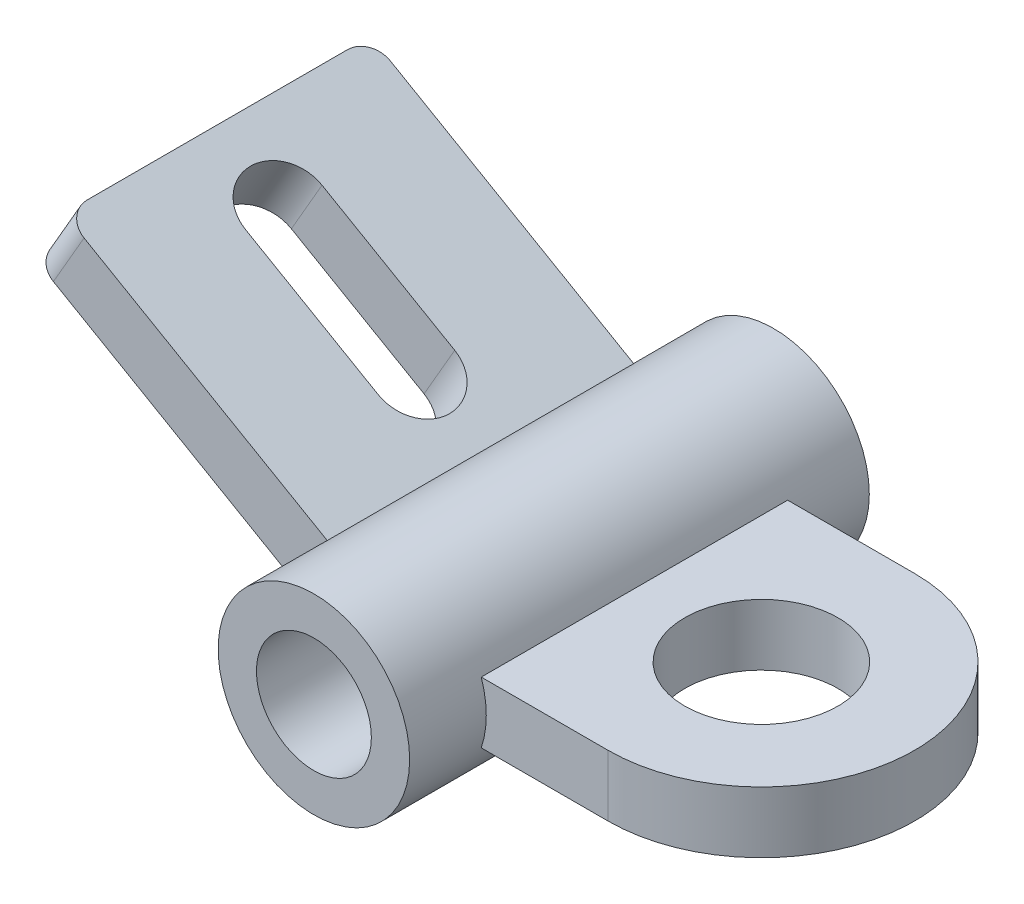
ISO-10303-21;
HEADER;
FILE_DESCRIPTION(('STEP AP214'),'2;1');
FILE_NAME('part.step','',(''),(''),'','','');
FILE_SCHEMA(('AUTOMOTIVE_DESIGN { 1 0 10303 214 1 1 1 1 }'));
ENDSEC;
DATA;
#1=APPLICATION_CONTEXT('core data for automotive mechanical design processes');
#2=APPLICATION_PROTOCOL_DEFINITION('international standard','automotive_design',2000,#1);
#3=PRODUCT_CONTEXT('',#1,'mechanical');
#4=PRODUCT('Part','Part','',(#3));
#5=PRODUCT_RELATED_PRODUCT_CATEGORY('part','',(#4));
#6=PRODUCT_DEFINITION_FORMATION('','',#4);
#7=PRODUCT_DEFINITION_CONTEXT('part definition',#1,'design');
#8=PRODUCT_DEFINITION('design','',#6,#7);
#9=PRODUCT_DEFINITION_SHAPE('','',#8);
#10=(LENGTH_UNIT() NAMED_UNIT(*) SI_UNIT(.MILLI.,.METRE.));
#11=(NAMED_UNIT(*) PLANE_ANGLE_UNIT() SI_UNIT($,.RADIAN.));
#12=(NAMED_UNIT(*) SI_UNIT($,.STERADIAN.) SOLID_ANGLE_UNIT());
#13=UNCERTAINTY_MEASURE_WITH_UNIT(LENGTH_MEASURE(1.E-05),#10,'distance_accuracy_value','');
#14=(GEOMETRIC_REPRESENTATION_CONTEXT(3) GLOBAL_UNCERTAINTY_ASSIGNED_CONTEXT((#13)) GLOBAL_UNIT_ASSIGNED_CONTEXT((#10,
#11,#12)) REPRESENTATION_CONTEXT('',''));
#15=CARTESIAN_POINT('',(0.,0.,0.));
#16=DIRECTION('',(0.,0.,1.));
#17=DIRECTION('',(1.,0.,0.));
#18=AXIS2_PLACEMENT_3D('',#15,#16,#17);
#19=CARTESIAN_POINT('',(0.,-8.,12.1976987447699));
#20=DIRECTION('',(0.,0.,1.));
#21=DIRECTION('',(1.,0.,0.));
#22=AXIS2_PLACEMENT_3D('',#19,#20,#21);
#23=PLANE('',#22);
#24=DIRECTION('',(1.,0.,0.));
#25=VECTOR('',#24,1.);
#26=CARTESIAN_POINT('',(0.,0.,12.1976987447699));
#27=LINE('',#26,#25);
#28=CARTESIAN_POINT('',(2.93186416832076,0.,12.1976987447699));
#29=VERTEX_POINT('',#28);
#30=CARTESIAN_POINT('',(19.5,0.,12.1976987447699));
#31=VERTEX_POINT('',#30);
#32=EDGE_CURVE('E235',#29,#31,#27,.T.);
#33=ORIENTED_EDGE('',*,*,#32,.F.);
#34=CARTESIAN_POINT('',(-8.91085511400625,-4.,12.1976987447699));
#35=DIRECTION('',(0.,0.,1.));
#36=DIRECTION('',(1.,0.,0.));
#37=AXIS2_PLACEMENT_3D('',#34,#35,#36);
#38=CIRCLE('',#37,12.5);
#39=CARTESIAN_POINT('',(2.93186416832076,-8.,12.1976987447699));
#40=VERTEX_POINT('',#39);
#41=EDGE_CURVE('E199',#40,#29,#38,.T.);
#42=ORIENTED_EDGE('',*,*,#41,.F.);
#43=DIRECTION('',(1.,0.,0.));
#44=VECTOR('',#43,1.);
#45=CARTESIAN_POINT('',(0.,-8.,12.1976987447699));
#46=LINE('',#45,#44);
#47=CARTESIAN_POINT('',(19.5,-8.,12.1976987447699));
#48=VERTEX_POINT('',#47);
#49=EDGE_CURVE('E226',#40,#48,#46,.T.);
#50=ORIENTED_EDGE('',*,*,#49,.T.);
#51=DIRECTION('',(0.,1.,0.));
#52=VECTOR('',#51,1.);
#53=CARTESIAN_POINT('',(19.5,-8.,12.1976987447699));
#54=LINE('',#53,#52);
#55=EDGE_CURVE('E232',#48,#31,#54,.T.);
#56=ORIENTED_EDGE('',*,*,#55,.T.);
#57=EDGE_LOOP('',(#33,#42,#50,#56));
#58=FACE_BOUND('',#57,.T.);
#59=ADVANCED_FACE('F37',(#58),#23,.T.);
#60=CARTESIAN_POINT('',(0.,-8.,-27.8023012552301));
#61=DIRECTION('',(0.,0.,-1.));
#62=DIRECTION('',(-1.,0.,0.));
#63=AXIS2_PLACEMENT_3D('',#60,#61,#62);
#64=PLANE('',#63);
#65=CARTESIAN_POINT('',(-8.91085511400625,-4.,-27.8023012552301));
#66=DIRECTION('',(0.,0.,-1.));
#67=DIRECTION('',(-1.,0.,0.));
#68=AXIS2_PLACEMENT_3D('',#65,#66,#67);
#69=CIRCLE('',#68,12.5);
#70=CARTESIAN_POINT('',(2.93186416832076,0.,-27.8023012552301));
#71=VERTEX_POINT('',#70);
#72=CARTESIAN_POINT('',(2.93186416832076,-8.,-27.8023012552301));
#73=VERTEX_POINT('',#72);
#74=EDGE_CURVE('E211',#71,#73,#69,.T.);
#75=ORIENTED_EDGE('',*,*,#74,.F.);
#76=DIRECTION('',(-1.,0.,0.));
#77=VECTOR('',#76,1.);
#78=CARTESIAN_POINT('',(0.,0.,-27.8023012552301));
#79=LINE('',#78,#77);
#80=CARTESIAN_POINT('',(19.5,0.,-27.8023012552301));
#81=VERTEX_POINT('',#80);
#82=EDGE_CURVE('E220',#81,#71,#79,.T.);
#83=ORIENTED_EDGE('',*,*,#82,.F.);
#84=DIRECTION('',(0.,1.,0.));
#85=VECTOR('',#84,1.);
#86=CARTESIAN_POINT('',(19.5,-8.,-27.8023012552301));
#87=LINE('',#86,#85);
#88=CARTESIAN_POINT('',(19.5,-8.,-27.8023012552301));
#89=VERTEX_POINT('',#88);
#90=EDGE_CURVE('E239',#89,#81,#87,.T.);
#91=ORIENTED_EDGE('',*,*,#90,.F.);
#92=DIRECTION('',(-1.,0.,0.));
#93=VECTOR('',#92,1.);
#94=CARTESIAN_POINT('',(0.,-8.,-27.8023012552301));
#95=LINE('',#94,#93);
#96=EDGE_CURVE('E223',#89,#73,#95,.T.);
#97=ORIENTED_EDGE('',*,*,#96,.T.);
#98=EDGE_LOOP('',(#75,#83,#91,#97));
#99=FACE_BOUND('',#98,.T.);
#100=ADVANCED_FACE('F295',(#99),#64,.T.);
#101=CARTESIAN_POINT('',(19.5,-8.,-7.80230125523011));
#102=DIRECTION('',(0.,1.,0.));
#103=DIRECTION('',(0.,0.,1.));
#104=AXIS2_PLACEMENT_3D('',#101,#102,#103);
#105=CYLINDRICAL_SURFACE('',#104,20.);
#106=CARTESIAN_POINT('',(19.5,0.,-7.80230125523011));
#107=DIRECTION('',(0.,1.,0.));
#108=DIRECTION('',(0.,0.,-1.));
#109=AXIS2_PLACEMENT_3D('',#106,#107,#108);
#110=CIRCLE('',#109,20.);
#111=EDGE_CURVE('E227',#31,#81,#110,.T.);
#112=ORIENTED_EDGE('',*,*,#111,.F.);
#113=ORIENTED_EDGE('',*,*,#55,.F.);
#114=CARTESIAN_POINT('',(19.5,-8.,-7.80230125523011));
#115=DIRECTION('',(0.,1.,0.));
#116=DIRECTION('',(0.,0.,-1.));
#117=AXIS2_PLACEMENT_3D('',#114,#115,#116);
#118=CIRCLE('',#117,20.);
#119=EDGE_CURVE('E229',#48,#89,#118,.T.);
#120=ORIENTED_EDGE('',*,*,#119,.T.);
#121=ORIENTED_EDGE('',*,*,#90,.T.);
#122=EDGE_LOOP('',(#112,#113,#120,#121));
#123=FACE_BOUND('',#122,.T.);
#124=ADVANCED_FACE('F301',(#123),#105,.T.);
#125=CARTESIAN_POINT('',(19.5,-8.,-7.80230125523011));
#126=DIRECTION('',(0.,-1.,0.));
#127=DIRECTION('',(0.,0.,-1.));
#128=AXIS2_PLACEMENT_3D('',#125,#126,#127);
#129=PLANE('',#128);
#130=DIRECTION('',(0.,0.,1.));
#131=VECTOR('',#130,1.);
#132=CARTESIAN_POINT('',(2.93186416832076,-8.,-37.8023012552301));
#133=LINE('',#132,#131);
#134=EDGE_CURVE('E214',#73,#40,#133,.T.);
#135=ORIENTED_EDGE('',*,*,#134,.F.);
#136=ORIENTED_EDGE('',*,*,#96,.F.);
#137=ORIENTED_EDGE('',*,*,#119,.F.);
#138=ORIENTED_EDGE('',*,*,#49,.F.);
#139=EDGE_LOOP('',(#135,#136,#137,#138));
#140=FACE_BOUND('',#139,.T.);
#141=CARTESIAN_POINT('',(19.5,-8.,-7.80230125523011));
#142=DIRECTION('',(0.,1.,0.));
#143=DIRECTION('',(0.,0.,1.));
#144=AXIS2_PLACEMENT_3D('',#141,#142,#143);
#145=CIRCLE('',#144,10.);
#146=CARTESIAN_POINT('',(19.5,-8.,2.19769874476989));
#147=VERTEX_POINT('',#146);
#148=EDGE_CURVE('E217',#147,#147,#145,.T.);
#149=ORIENTED_EDGE('',*,*,#148,.T.);
#150=EDGE_LOOP('',(#149));
#151=FACE_BOUND('',#150,.T.);
#152=ADVANCED_FACE('F307',(#140,#151),#129,.T.);
#153=CARTESIAN_POINT('',(19.5,0.,-7.80230125523011));
#154=DIRECTION('',(0.,-1.,0.));
#155=DIRECTION('',(0.,0.,-1.));
#156=AXIS2_PLACEMENT_3D('',#153,#154,#155);
#157=PLANE('',#156);
#158=CARTESIAN_POINT('',(19.5,0.,-7.80230125523011));
#159=DIRECTION('',(0.,1.,0.));
#160=DIRECTION('',(0.,0.,1.));
#161=AXIS2_PLACEMENT_3D('',#158,#159,#160);
#162=CIRCLE('',#161,10.);
#163=CARTESIAN_POINT('',(19.5,0.,2.19769874476989));
#164=VERTEX_POINT('',#163);
#165=EDGE_CURVE('E216',#164,#164,#162,.T.);
#166=ORIENTED_EDGE('',*,*,#165,.F.);
#167=EDGE_LOOP('',(#166));
#168=FACE_BOUND('',#167,.T.);
#169=ORIENTED_EDGE('',*,*,#82,.T.);
#170=DIRECTION('',(0.,0.,1.));
#171=VECTOR('',#170,1.);
#172=CARTESIAN_POINT('',(2.93186416832076,0.,-37.8023012552301));
#173=LINE('',#172,#171);
#174=EDGE_CURVE('E241',#71,#29,#173,.T.);
#175=ORIENTED_EDGE('',*,*,#174,.T.);
#176=ORIENTED_EDGE('',*,*,#32,.T.);
#177=ORIENTED_EDGE('',*,*,#111,.T.);
#178=EDGE_LOOP('',(#169,#175,#176,#177));
#179=FACE_BOUND('',#178,.T.);
#180=ADVANCED_FACE('F309',(#168,#179),#157,.F.);
#181=CARTESIAN_POINT('',(19.5,-8.,-7.80230125523011));
#182=DIRECTION('',(0.,1.,0.));
#183=DIRECTION('',(0.,0.,1.));
#184=AXIS2_PLACEMENT_3D('',#181,#182,#183);
#185=CYLINDRICAL_SURFACE('',#184,10.);
#186=ORIENTED_EDGE('',*,*,#148,.F.);
#187=EDGE_LOOP('',(#186));
#188=FACE_BOUND('',#187,.T.);
#189=ORIENTED_EDGE('',*,*,#165,.T.);
#190=EDGE_LOOP('',(#189));
#191=FACE_BOUND('',#190,.T.);
#192=ADVANCED_FACE('F312',(#188,#191),#185,.F.);
#193=CARTESIAN_POINT('',(-8.91085511400625,-4.,-37.8023012552301));
#194=DIRECTION('',(0.,0.,1.));
#195=DIRECTION('',(1.,0.,0.));
#196=AXIS2_PLACEMENT_3D('',#193,#194,#195);
#197=CYLINDRICAL_SURFACE('',#196,12.5);
#198=CARTESIAN_POINT('',(-8.91085511400625,-4.,-27.8023012552301));
#199=DIRECTION('',(0.,0.,-1.));
#200=DIRECTION('',(-1.,0.,0.));
#201=AXIS2_PLACEMENT_3D('',#198,#199,#200);
#202=CIRCLE('',#201,12.5);
#203=CARTESIAN_POINT('',(-17.1669508623892,5.38546125630127,-27.8023012552301));
#204=VERTEX_POINT('',#203);
#205=CARTESIAN_POINT('',(-21.1669508623893,-1.54274197397423,-27.8023012552301));
#206=VERTEX_POINT('',#205);
#207=EDGE_CURVE('E254',#204,#206,#202,.F.);
#208=ORIENTED_EDGE('',*,*,#207,.F.);
#209=DIRECTION('',(0.,0.,1.));
#210=VECTOR('',#209,1.);
#211=CARTESIAN_POINT('',(-17.1669508623892,5.38546125630127,-37.8023012552301));
#212=LINE('',#211,#210);
#213=CARTESIAN_POINT('',(-17.1669508623892,5.38546125630127,12.1976987447699));
#214=VERTEX_POINT('',#213);
#215=EDGE_CURVE('E249',#214,#204,#212,.F.);
#216=ORIENTED_EDGE('',*,*,#215,.F.);
#217=CARTESIAN_POINT('',(-8.91085511400625,-4.,12.1976987447699));
#218=DIRECTION('',(0.,0.,-1.));
#219=DIRECTION('',(-1.,0.,0.));
#220=AXIS2_PLACEMENT_3D('',#217,#218,#219);
#221=CIRCLE('',#220,12.5);
#222=CARTESIAN_POINT('',(-21.1669508623893,-1.54274197397423,12.1976987447699));
#223=VERTEX_POINT('',#222);
#224=EDGE_CURVE('E246',#214,#223,#221,.F.);
#225=ORIENTED_EDGE('',*,*,#224,.T.);
#226=DIRECTION('',(0.,0.,1.));
#227=VECTOR('',#226,1.);
#228=CARTESIAN_POINT('',(-21.1669508623893,-1.54274197397423,-37.8023012552301));
#229=LINE('',#228,#227);
#230=EDGE_CURVE('E251',#206,#223,#229,.T.);
#231=ORIENTED_EDGE('',*,*,#230,.F.);
#232=EDGE_LOOP('',(#208,#216,#225,#231));
#233=FACE_BOUND('',#232,.T.);
#234=CARTESIAN_POINT('',(-8.91085511400625,-4.,-37.8023012552301));
#235=DIRECTION('',(0.,0.,1.));
#236=DIRECTION('',(1.,0.,0.));
#237=AXIS2_PLACEMENT_3D('',#234,#235,#236);
#238=CIRCLE('',#237,12.5);
#239=CARTESIAN_POINT('',(3.58914488599375,-4.,-37.8023012552301));
#240=VERTEX_POINT('',#239);
#241=EDGE_CURVE('E208',#240,#240,#238,.T.);
#242=ORIENTED_EDGE('',*,*,#241,.T.);
#243=EDGE_LOOP('',(#242));
#244=FACE_BOUND('',#243,.T.);
#245=ORIENTED_EDGE('',*,*,#74,.T.);
#246=ORIENTED_EDGE('',*,*,#134,.T.);
#247=ORIENTED_EDGE('',*,*,#41,.T.);
#248=ORIENTED_EDGE('',*,*,#174,.F.);
#249=EDGE_LOOP('',(#245,#246,#247,#248));
#250=FACE_BOUND('',#249,.T.);
#251=CARTESIAN_POINT('',(-8.91085511400625,-4.,22.1976987447699));
#252=DIRECTION('',(0.,0.,1.));
#253=DIRECTION('',(1.,0.,0.));
#254=AXIS2_PLACEMENT_3D('',#251,#252,#253);
#255=CIRCLE('',#254,12.5);
#256=CARTESIAN_POINT('',(3.58914488599375,-4.,22.1976987447699));
#257=VERTEX_POINT('',#256);
#258=EDGE_CURVE('E200',#257,#257,#255,.T.);
#259=ORIENTED_EDGE('',*,*,#258,.F.);
#260=EDGE_LOOP('',(#259));
#261=FACE_BOUND('',#260,.T.);
#262=ADVANCED_FACE('F283',(#233,#244,#250,#261),#197,.T.);
#263=CARTESIAN_POINT('',(-8.91085511400625,-4.,-37.8023012552301));
#264=DIRECTION('',(0.,0.,1.));
#265=DIRECTION('',(1.,0.,0.));
#266=AXIS2_PLACEMENT_3D('',#263,#264,#265);
#267=PLANE('',#266);
#268=CARTESIAN_POINT('',(-8.91085511400625,-4.,-37.8023012552301));
#269=DIRECTION('',(0.,0.,1.));
#270=DIRECTION('',(1.,0.,0.));
#271=AXIS2_PLACEMENT_3D('',#268,#269,#270);
#272=CIRCLE('',#271,7.5);
#273=CARTESIAN_POINT('',(-1.41085511400625,-4.,-37.8023012552301));
#274=VERTEX_POINT('',#273);
#275=EDGE_CURVE('E203',#274,#274,#272,.T.);
#276=ORIENTED_EDGE('',*,*,#275,.T.);
#277=EDGE_LOOP('',(#276));
#278=FACE_BOUND('',#277,.T.);
#279=ORIENTED_EDGE('',*,*,#241,.F.);
#280=EDGE_LOOP('',(#279));
#281=FACE_BOUND('',#280,.T.);
#282=ADVANCED_FACE('F322',(#278,#281),#267,.F.);
#283=CARTESIAN_POINT('',(-8.91085511400625,-4.,-37.8023012552301));
#284=DIRECTION('',(0.,0.,1.));
#285=DIRECTION('',(1.,0.,0.));
#286=AXIS2_PLACEMENT_3D('',#283,#284,#285);
#287=CYLINDRICAL_SURFACE('',#286,7.5);
#288=ORIENTED_EDGE('',*,*,#275,.F.);
#289=EDGE_LOOP('',(#288));
#290=FACE_BOUND('',#289,.T.);
#291=CARTESIAN_POINT('',(-8.91085511400625,-4.,22.1976987447699));
#292=DIRECTION('',(0.,0.,1.));
#293=DIRECTION('',(1.,0.,0.));
#294=AXIS2_PLACEMENT_3D('',#291,#292,#293);
#295=CIRCLE('',#294,7.5);
#296=CARTESIAN_POINT('',(-1.41085511400625,-4.,22.1976987447699));
#297=VERTEX_POINT('',#296);
#298=EDGE_CURVE('E195',#297,#297,#295,.T.);
#299=ORIENTED_EDGE('',*,*,#298,.T.);
#300=EDGE_LOOP('',(#299));
#301=FACE_BOUND('',#300,.T.);
#302=ADVANCED_FACE('F325',(#290,#301),#287,.F.);
#303=CARTESIAN_POINT('',(-8.91085511400625,-4.,22.1976987447699));
#304=DIRECTION('',(0.,0.,1.));
#305=DIRECTION('',(1.,0.,0.));
#306=AXIS2_PLACEMENT_3D('',#303,#304,#305);
#307=PLANE('',#306);
#308=ORIENTED_EDGE('',*,*,#258,.T.);
#309=EDGE_LOOP('',(#308));
#310=FACE_BOUND('',#309,.T.);
#311=ORIENTED_EDGE('',*,*,#298,.F.);
#312=EDGE_LOOP('',(#311));
#313=FACE_BOUND('',#312,.T.);
#314=ADVANCED_FACE('F329',(#310,#313),#307,.T.);
#315=CARTESIAN_POINT('',(-18.0325169375836,-3.35240824421785,-27.8023012552301));
#316=DIRECTION('',(-0.500000000000001,-0.866025403784438,0.));
#317=DIRECTION('',(0.866025403784438,-0.500000000000001,0.));
#318=AXIS2_PLACEMENT_3D('',#315,#316,#317);
#319=PLANE('',#318);
#320=CARTESIAN_POINT('',(-46.8509093710604,13.2858983848623,-7.80230125523012));
#321=DIRECTION('',(-0.500000000000001,-0.866025403784438,0.));
#322=DIRECTION('',(0.866025403784438,-0.500000000000001,0.));
#323=AXIS2_PLACEMENT_3D('',#320,#321,#322);
#324=CIRCLE('',#323,5.);
#325=CARTESIAN_POINT('',(-46.8509093710604,13.2858983848623,-2.80230125523011));
#326=VERTEX_POINT('',#325);
#327=CARTESIAN_POINT('',(-46.8509093710604,13.2858983848623,-12.8023012552301));
#328=VERTEX_POINT('',#327);
#329=EDGE_CURVE('E181',#326,#328,#324,.T.);
#330=ORIENTED_EDGE('',*,*,#329,.F.);
#331=DIRECTION('',(-0.866025403784438,0.500000000000001,0.));
#332=VECTOR('',#331,1.);
#333=CARTESIAN_POINT('',(-18.0325169375836,-3.35240824421785,-2.80230125523011));
#334=LINE('',#333,#332);
#335=CARTESIAN_POINT('',(-29.5304012953717,3.28589838486227,-2.80230125523011));
#336=VERTEX_POINT('',#335);
#337=EDGE_CURVE('E174',#336,#326,#334,.T.);
#338=ORIENTED_EDGE('',*,*,#337,.F.);
#339=CARTESIAN_POINT('',(-29.5304012953717,3.28589838486227,-7.80230125523012));
#340=DIRECTION('',(-0.500000000000001,-0.866025403784438,0.));
#341=DIRECTION('',(0.866025403784438,-0.500000000000001,0.));
#342=AXIS2_PLACEMENT_3D('',#339,#340,#341);
#343=CIRCLE('',#342,5.);
#344=CARTESIAN_POINT('',(-29.5304012953717,3.28589838486227,-12.8023012552301));
#345=VERTEX_POINT('',#344);
#346=EDGE_CURVE('E150',#345,#336,#343,.T.);
#347=ORIENTED_EDGE('',*,*,#346,.F.);
#348=DIRECTION('',(0.866025403784438,-0.500000000000001,0.));
#349=VECTOR('',#348,1.);
#350=CARTESIAN_POINT('',(-18.0325169375836,-3.35240824421785,-12.8023012552301));
#351=LINE('',#350,#349);
#352=EDGE_CURVE('E179',#328,#345,#351,.T.);
#353=ORIENTED_EDGE('',*,*,#352,.F.);
#354=EDGE_LOOP('',(#330,#338,#347,#353));
#355=FACE_BOUND('',#354,.T.);
#356=DIRECTION('',(0.,0.,1.));
#357=VECTOR('',#356,1.);
#358=CARTESIAN_POINT('',(-55.5111634089048,18.2858983848623,-27.8023012552301));
#359=LINE('',#358,#357);
#360=CARTESIAN_POINT('',(-55.5111634089048,18.2858983848623,-24.8023012552301));
#361=VERTEX_POINT('',#360);
#362=CARTESIAN_POINT('',(-55.5111634089048,18.2858983848623,9.19769874476989));
#363=VERTEX_POINT('',#362);
#364=EDGE_CURVE('E192',#361,#363,#359,.T.);
#365=ORIENTED_EDGE('',*,*,#364,.F.);
#366=CARTESIAN_POINT('',(-52.9130871975515,16.7858983848623,-24.8023012552301));
#367=DIRECTION('',(-0.500000000000001,-0.866025403784438,0.));
#368=DIRECTION('',(0.866025403784438,-0.500000000000001,0.));
#369=AXIS2_PLACEMENT_3D('',#366,#367,#368);
#370=CIRCLE('',#369,3.);
#371=CARTESIAN_POINT('',(-52.9130871975515,16.7858983848623,-27.8023012552301));
#372=VERTEX_POINT('',#371);
#373=EDGE_CURVE('E264',#361,#372,#370,.T.);
#374=ORIENTED_EDGE('',*,*,#373,.T.);
#375=DIRECTION('',(0.866025403784438,-0.500000000000001,0.));
#376=VECTOR('',#375,1.);
#377=CARTESIAN_POINT('',(-18.0325169375836,-3.35240824421785,-27.8023012552301));
#378=LINE('',#377,#376);
#379=EDGE_CURVE('E186',#372,#206,#378,.T.);
#380=ORIENTED_EDGE('',*,*,#379,.T.);
#381=ORIENTED_EDGE('',*,*,#230,.T.);
#382=DIRECTION('',(0.866025403784438,-0.500000000000001,0.));
#383=VECTOR('',#382,1.);
#384=CARTESIAN_POINT('',(-18.0325169375836,-3.35240824421785,12.1976987447699));
#385=LINE('',#384,#383);
#386=CARTESIAN_POINT('',(-52.9130871975515,16.7858983848623,12.1976987447699));
#387=VERTEX_POINT('',#386);
#388=EDGE_CURVE('E187',#387,#223,#385,.T.);
#389=ORIENTED_EDGE('',*,*,#388,.F.);
#390=CARTESIAN_POINT('',(-52.9130871975515,16.7858983848623,9.19769874476989));
#391=DIRECTION('',(-0.500000000000001,-0.866025403784438,0.));
#392=DIRECTION('',(0.866025403784438,-0.500000000000001,0.));
#393=AXIS2_PLACEMENT_3D('',#390,#391,#392);
#394=CIRCLE('',#393,3.);
#395=EDGE_CURVE('E262',#387,#363,#394,.T.);
#396=ORIENTED_EDGE('',*,*,#395,.T.);
#397=EDGE_LOOP('',(#365,#374,#380,#381,#389,#396));
#398=FACE_BOUND('',#397,.T.);
#399=ADVANCED_FACE('F277',(#355,#398),#319,.T.);
#400=CARTESIAN_POINT('',(-55.5111634089048,18.2858983848623,-27.8023012552301));
#401=DIRECTION('',(-0.866025403784438,0.500000000000001,0.));
#402=DIRECTION('',(-0.500000000000001,-0.866025403784438,0.));
#403=AXIS2_PLACEMENT_3D('',#400,#401,#402);
#404=PLANE('',#403);
#405=DIRECTION('',(0.,0.,1.));
#406=VECTOR('',#405,1.);
#407=CARTESIAN_POINT('',(-51.5111634089048,25.2141016151378,-27.8023012552301));
#408=LINE('',#407,#406);
#409=CARTESIAN_POINT('',(-51.5111634089048,25.2141016151378,-24.8023012552301));
#410=VERTEX_POINT('',#409);
#411=CARTESIAN_POINT('',(-51.5111634089048,25.2141016151378,9.19769874476989));
#412=VERTEX_POINT('',#411);
#413=EDGE_CURVE('E189',#410,#412,#408,.T.);
#414=ORIENTED_EDGE('',*,*,#413,.F.);
#415=DIRECTION('',(-0.500000000000001,-0.866025403784438,0.));
#416=VECTOR('',#415,1.);
#417=CARTESIAN_POINT('',(-55.5111634089048,18.2858983848623,-24.8023012552301));
#418=LINE('',#417,#416);
#419=EDGE_CURVE('E259',#410,#361,#418,.T.);
#420=ORIENTED_EDGE('',*,*,#419,.T.);
#421=ORIENTED_EDGE('',*,*,#364,.T.);
#422=DIRECTION('',(-0.500000000000001,-0.866025403784438,0.));
#423=VECTOR('',#422,1.);
#424=CARTESIAN_POINT('',(-51.5111634089048,25.2141016151378,9.19769874476989));
#425=LINE('',#424,#423);
#426=EDGE_CURVE('E257',#363,#412,#425,.F.);
#427=ORIENTED_EDGE('',*,*,#426,.T.);
#428=EDGE_LOOP('',(#414,#420,#421,#427));
#429=FACE_BOUND('',#428,.T.);
#430=ADVANCED_FACE('F272',(#429),#404,.T.);
#431=CARTESIAN_POINT('',(-51.5111634089048,25.2141016151378,-27.8023012552301));
#432=DIRECTION('',(0.500000000000001,0.866025403784438,0.));
#433=DIRECTION('',(-0.866025403784438,0.500000000000001,0.));
#434=AXIS2_PLACEMENT_3D('',#431,#432,#433);
#435=PLANE('',#434);
#436=CARTESIAN_POINT('',(-42.8509093710604,20.2141016151378,-7.80230125523012));
#437=DIRECTION('',(0.500000000000001,0.866025403784438,0.));
#438=DIRECTION('',(-0.866025403784438,0.500000000000001,0.));
#439=AXIS2_PLACEMENT_3D('',#436,#437,#438);
#440=CIRCLE('',#439,5.);
#441=CARTESIAN_POINT('',(-42.8509093710604,20.2141016151378,-12.8023012552301));
#442=VERTEX_POINT('',#441);
#443=CARTESIAN_POINT('',(-42.8509093710605,20.2141016151378,-2.80230125523011));
#444=VERTEX_POINT('',#443);
#445=EDGE_CURVE('E163',#442,#444,#440,.T.);
#446=ORIENTED_EDGE('',*,*,#445,.F.);
#447=DIRECTION('',(-0.866025403784438,0.500000000000001,0.));
#448=VECTOR('',#447,1.);
#449=CARTESIAN_POINT('',(-42.8509093710604,20.2141016151378,-12.8023012552301));
#450=LINE('',#449,#448);
#451=CARTESIAN_POINT('',(-25.5304012953717,10.2141016151378,-12.8023012552301));
#452=VERTEX_POINT('',#451);
#453=EDGE_CURVE('E167',#452,#442,#450,.T.);
#454=ORIENTED_EDGE('',*,*,#453,.F.);
#455=CARTESIAN_POINT('',(-25.5304012953717,10.2141016151378,-7.80230125523012));
#456=DIRECTION('',(0.500000000000001,0.866025403784438,0.));
#457=DIRECTION('',(-0.866025403784438,0.500000000000001,0.));
#458=AXIS2_PLACEMENT_3D('',#455,#456,#457);
#459=CIRCLE('',#458,5.);
#460=CARTESIAN_POINT('',(-25.5304012953717,10.2141016151378,-2.80230125523011));
#461=VERTEX_POINT('',#460);
#462=EDGE_CURVE('E147',#461,#452,#459,.T.);
#463=ORIENTED_EDGE('',*,*,#462,.F.);
#464=DIRECTION('',(0.866025403784438,-0.500000000000001,0.));
#465=VECTOR('',#464,1.);
#466=CARTESIAN_POINT('',(-42.8509093710604,20.2141016151378,-2.80230125523011));
#467=LINE('',#466,#465);
#468=EDGE_CURVE('E158',#444,#461,#467,.T.);
#469=ORIENTED_EDGE('',*,*,#468,.F.);
#470=EDGE_LOOP('',(#446,#454,#463,#469));
#471=FACE_BOUND('',#470,.T.);
#472=DIRECTION('',(-0.866025403784438,0.500000000000001,0.));
#473=VECTOR('',#472,1.);
#474=CARTESIAN_POINT('',(-51.5111634089048,25.2141016151378,-27.8023012552301));
#475=LINE('',#474,#473);
#476=CARTESIAN_POINT('',(-48.9130871975515,23.7141016151378,-27.8023012552301));
#477=VERTEX_POINT('',#476);
#478=EDGE_CURVE('E184',#204,#477,#475,.T.);
#479=ORIENTED_EDGE('',*,*,#478,.T.);
#480=CARTESIAN_POINT('',(-48.9130871975515,23.7141016151378,-24.8023012552301));
#481=DIRECTION('',(0.500000000000001,0.866025403784438,0.));
#482=DIRECTION('',(-0.866025403784438,0.500000000000001,0.));
#483=AXIS2_PLACEMENT_3D('',#480,#481,#482);
#484=CIRCLE('',#483,3.);
#485=EDGE_CURVE('E45',#477,#410,#484,.T.);
#486=ORIENTED_EDGE('',*,*,#485,.T.);
#487=ORIENTED_EDGE('',*,*,#413,.T.);
#488=CARTESIAN_POINT('',(-48.9130871975515,23.7141016151378,9.19769874476989));
#489=DIRECTION('',(0.500000000000001,0.866025403784438,0.));
#490=DIRECTION('',(-0.866025403784438,0.500000000000001,0.));
#491=AXIS2_PLACEMENT_3D('',#488,#489,#490);
#492=CIRCLE('',#491,3.);
#493=CARTESIAN_POINT('',(-48.9130871975515,23.7141016151378,12.1976987447699));
#494=VERTEX_POINT('',#493);
#495=EDGE_CURVE('E52',#412,#494,#492,.T.);
#496=ORIENTED_EDGE('',*,*,#495,.T.);
#497=DIRECTION('',(-0.866025403784438,0.500000000000001,0.));
#498=VECTOR('',#497,1.);
#499=CARTESIAN_POINT('',(-51.5111634089048,25.2141016151378,12.1976987447699));
#500=LINE('',#499,#498);
#501=EDGE_CURVE('E183',#214,#494,#500,.T.);
#502=ORIENTED_EDGE('',*,*,#501,.F.);
#503=ORIENTED_EDGE('',*,*,#215,.T.);
#504=EDGE_LOOP('',(#479,#486,#487,#496,#502,#503));
#505=FACE_BOUND('',#504,.T.);
#506=ADVANCED_FACE('F165',(#471,#505),#435,.T.);
#507=CARTESIAN_POINT('',(0.,0.,-27.8023012552301));
#508=DIRECTION('',(0.,0.,-1.));
#509=DIRECTION('',(-1.,0.,0.));
#510=AXIS2_PLACEMENT_3D('',#507,#508,#509);
#511=PLANE('',#510);
#512=ORIENTED_EDGE('',*,*,#379,.F.);
#513=DIRECTION('',(-0.500000000000001,-0.866025403784438,0.));
#514=VECTOR('',#513,1.);
#515=CARTESIAN_POINT('',(-46.953322611481,27.108513449086,-27.8023012552301));
#516=LINE('',#515,#514);
#517=EDGE_CURVE('E60',#372,#477,#516,.F.);
#518=ORIENTED_EDGE('',*,*,#517,.T.);
#519=ORIENTED_EDGE('',*,*,#478,.F.);
#520=ORIENTED_EDGE('',*,*,#207,.T.);
#521=EDGE_LOOP('',(#512,#518,#519,#520));
#522=FACE_BOUND('',#521,.T.);
#523=ADVANCED_FACE('F278',(#522),#511,.T.);
#524=CARTESIAN_POINT('',(0.,0.,12.1976987447699));
#525=DIRECTION('',(0.,0.,-1.));
#526=DIRECTION('',(-1.,0.,0.));
#527=AXIS2_PLACEMENT_3D('',#524,#525,#526);
#528=PLANE('',#527);
#529=ORIENTED_EDGE('',*,*,#501,.T.);
#530=DIRECTION('',(-0.500000000000001,-0.866025403784438,0.));
#531=VECTOR('',#530,1.);
#532=CARTESIAN_POINT('',(-52.9130871975515,16.7858983848623,12.1976987447699));
#533=LINE('',#532,#531);
#534=EDGE_CURVE('E11',#494,#387,#533,.T.);
#535=ORIENTED_EDGE('',*,*,#534,.T.);
#536=ORIENTED_EDGE('',*,*,#388,.T.);
#537=ORIENTED_EDGE('',*,*,#224,.F.);
#538=EDGE_LOOP('',(#529,#535,#536,#537));
#539=FACE_BOUND('',#538,.T.);
#540=ADVANCED_FACE('F287',(#539),#528,.F.);
#541=CARTESIAN_POINT('',(-61.9136452184379,-12.8035254037844,-7.80230125523012));
#542=DIRECTION('',(0.500000000000001,0.866025403784438,0.));
#543=DIRECTION('',(-0.866025403784438,0.500000000000001,0.));
#544=AXIS2_PLACEMENT_3D('',#541,#542,#543);
#545=CYLINDRICAL_SURFACE('',#544,5.);
#546=ORIENTED_EDGE('',*,*,#329,.T.);
#547=DIRECTION('',(0.500000000000001,0.866025403784438,0.));
#548=VECTOR('',#547,1.);
#549=CARTESIAN_POINT('',(-61.9136452184379,-12.8035254037844,-12.8023012552301));
#550=LINE('',#549,#548);
#551=EDGE_CURVE('E172',#328,#442,#550,.T.);
#552=ORIENTED_EDGE('',*,*,#551,.T.);
#553=ORIENTED_EDGE('',*,*,#445,.T.);
#554=DIRECTION('',(0.500000000000001,0.866025403784438,0.));
#555=VECTOR('',#554,1.);
#556=CARTESIAN_POINT('',(-61.9136452184379,-12.8035254037844,-2.80230125523011));
#557=LINE('',#556,#555);
#558=EDGE_CURVE('E154',#326,#444,#557,.T.);
#559=ORIENTED_EDGE('',*,*,#558,.F.);
#560=EDGE_LOOP('',(#546,#552,#553,#559));
#561=FACE_BOUND('',#560,.T.);
#562=ADVANCED_FACE('F343',(#561),#545,.F.);
#563=CARTESIAN_POINT('',(-61.9136452184379,-12.8035254037844,-12.8023012552301));
#564=DIRECTION('',(0.,0.,-1.));
#565=DIRECTION('',(-1.,0.,0.));
#566=AXIS2_PLACEMENT_3D('',#563,#564,#565);
#567=PLANE('',#566);
#568=ORIENTED_EDGE('',*,*,#352,.T.);
#569=DIRECTION('',(0.500000000000001,0.866025403784438,0.));
#570=VECTOR('',#569,1.);
#571=CARTESIAN_POINT('',(-44.5931371427491,-22.8035254037844,-12.8023012552301));
#572=LINE('',#571,#570);
#573=EDGE_CURVE('E153',#345,#452,#572,.T.);
#574=ORIENTED_EDGE('',*,*,#573,.T.);
#575=ORIENTED_EDGE('',*,*,#453,.T.);
#576=ORIENTED_EDGE('',*,*,#551,.F.);
#577=EDGE_LOOP('',(#568,#574,#575,#576));
#578=FACE_BOUND('',#577,.T.);
#579=ADVANCED_FACE('F348',(#578),#567,.F.);
#580=CARTESIAN_POINT('',(-44.5931371427491,-22.8035254037844,-7.80230125523012));
#581=DIRECTION('',(0.500000000000001,0.866025403784438,0.));
#582=DIRECTION('',(-0.866025403784438,0.500000000000001,0.));
#583=AXIS2_PLACEMENT_3D('',#580,#581,#582);
#584=CYLINDRICAL_SURFACE('',#583,5.);
#585=ORIENTED_EDGE('',*,*,#346,.T.);
#586=DIRECTION('',(0.500000000000001,0.866025403784438,0.));
#587=VECTOR('',#586,1.);
#588=CARTESIAN_POINT('',(-44.5931371427491,-22.8035254037844,-2.80230125523011));
#589=LINE('',#588,#587);
#590=EDGE_CURVE('E142',#336,#461,#589,.T.);
#591=ORIENTED_EDGE('',*,*,#590,.T.);
#592=ORIENTED_EDGE('',*,*,#462,.T.);
#593=ORIENTED_EDGE('',*,*,#573,.F.);
#594=EDGE_LOOP('',(#585,#591,#592,#593));
#595=FACE_BOUND('',#594,.T.);
#596=ADVANCED_FACE('F144',(#595),#584,.F.);
#597=CARTESIAN_POINT('',(-61.9136452184379,-12.8035254037844,-2.80230125523011));
#598=DIRECTION('',(0.,0.,1.));
#599=DIRECTION('',(1.,0.,0.));
#600=AXIS2_PLACEMENT_3D('',#597,#598,#599);
#601=PLANE('',#600);
#602=ORIENTED_EDGE('',*,*,#337,.T.);
#603=ORIENTED_EDGE('',*,*,#558,.T.);
#604=ORIENTED_EDGE('',*,*,#468,.T.);
#605=ORIENTED_EDGE('',*,*,#590,.F.);
#606=EDGE_LOOP('',(#602,#603,#604,#605));
#607=FACE_BOUND('',#606,.T.);
#608=ADVANCED_FACE('F159',(#607),#601,.F.);
#609=CARTESIAN_POINT('',(-52.9130871975515,16.7858983848623,-24.8023012552301));
#610=DIRECTION('',(-0.500000000000001,-0.866025403784438,0.));
#611=DIRECTION('',(0.866025403784438,-0.500000000000001,0.));
#612=AXIS2_PLACEMENT_3D('',#609,#610,#611);
#613=CYLINDRICAL_SURFACE('',#612,3.);
#614=ORIENTED_EDGE('',*,*,#485,.F.);
#615=ORIENTED_EDGE('',*,*,#517,.F.);
#616=ORIENTED_EDGE('',*,*,#373,.F.);
#617=ORIENTED_EDGE('',*,*,#419,.F.);
#618=EDGE_LOOP('',(#614,#615,#616,#617));
#619=FACE_BOUND('',#618,.T.);
#620=ADVANCED_FACE('F275',(#619),#613,.T.);
#621=CARTESIAN_POINT('',(-46.953322611481,27.108513449086,9.19769874476989));
#622=DIRECTION('',(0.500000000000001,0.866025403784438,0.));
#623=DIRECTION('',(-0.866025403784438,0.500000000000001,0.));
#624=AXIS2_PLACEMENT_3D('',#621,#622,#623);
#625=CYLINDRICAL_SURFACE('',#624,3.);
#626=ORIENTED_EDGE('',*,*,#495,.F.);
#627=ORIENTED_EDGE('',*,*,#426,.F.);
#628=ORIENTED_EDGE('',*,*,#395,.F.);
#629=ORIENTED_EDGE('',*,*,#534,.F.);
#630=EDGE_LOOP('',(#626,#627,#628,#629));
#631=FACE_BOUND('',#630,.T.);
#632=ADVANCED_FACE('F39',(#631),#625,.T.);
#633=CLOSED_SHELL('',(#59,#100,#124,#152,#180,#192,#262,#282,#302,#314,#399,#430,#506,#523,#540,
#562,#579,#596,#608,#620,#632));
#634=MANIFOLD_SOLID_BREP('B2',#633);
#635=ADVANCED_BREP_SHAPE_REPRESENTATION('',(#18,#634),#14);
#636=SHAPE_DEFINITION_REPRESENTATION(#9,#635);
ENDSEC;
END-ISO-10303-21;
